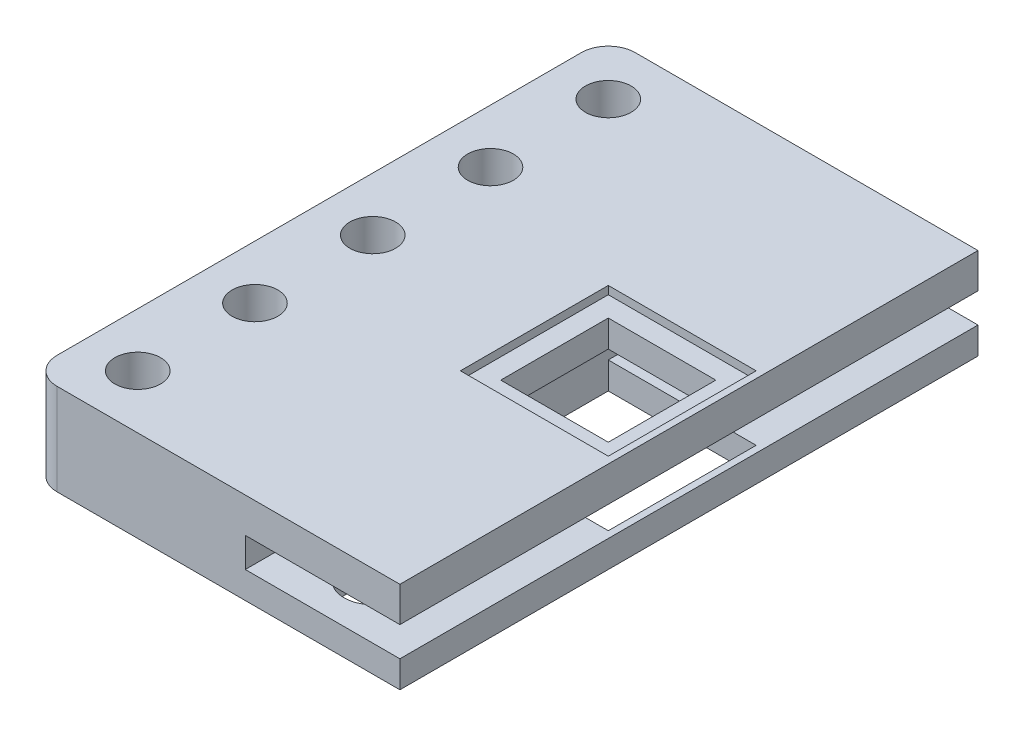
ISO-10303-21;
HEADER;
FILE_DESCRIPTION(('STEP AP214'),'2;1');
FILE_NAME('part.step','',(''),(''),'','','');
FILE_SCHEMA(('AUTOMOTIVE_DESIGN { 1 0 10303 214 1 1 1 1 }'));
ENDSEC;
DATA;
#1=APPLICATION_CONTEXT('core data for automotive mechanical design processes');
#2=APPLICATION_PROTOCOL_DEFINITION('international standard','automotive_design',2000,#1);
#3=PRODUCT_CONTEXT('',#1,'mechanical');
#4=PRODUCT('Part','Part','',(#3));
#5=PRODUCT_RELATED_PRODUCT_CATEGORY('part','',(#4));
#6=PRODUCT_DEFINITION_FORMATION('','',#4);
#7=PRODUCT_DEFINITION_CONTEXT('part definition',#1,'design');
#8=PRODUCT_DEFINITION('design','',#6,#7);
#9=PRODUCT_DEFINITION_SHAPE('','',#8);
#10=(LENGTH_UNIT() NAMED_UNIT(*) SI_UNIT(.MILLI.,.METRE.));
#11=(NAMED_UNIT(*) PLANE_ANGLE_UNIT() SI_UNIT($,.RADIAN.));
#12=(NAMED_UNIT(*) SI_UNIT($,.STERADIAN.) SOLID_ANGLE_UNIT());
#13=UNCERTAINTY_MEASURE_WITH_UNIT(LENGTH_MEASURE(1.E-05),#10,'distance_accuracy_value','');
#14=(GEOMETRIC_REPRESENTATION_CONTEXT(3) GLOBAL_UNCERTAINTY_ASSIGNED_CONTEXT((#13)) GLOBAL_UNIT_ASSIGNED_CONTEXT((#10,
#11,#12)) REPRESENTATION_CONTEXT('',''));
#15=CARTESIAN_POINT('',(0.,0.,0.));
#16=DIRECTION('',(0.,0.,1.));
#17=DIRECTION('',(1.,0.,0.));
#18=AXIS2_PLACEMENT_3D('',#15,#16,#17);
#19=CARTESIAN_POINT('',(-0.933954619124796,0.,-15.7376016731128));
#20=DIRECTION('',(-1.,0.,0.));
#21=DIRECTION('',(0.,0.,1.));
#22=AXIS2_PLACEMENT_3D('',#19,#20,#21);
#23=PLANE('',#22);
#24=DIRECTION('',(0.,-1.,0.));
#25=VECTOR('',#24,1.);
#26=CARTESIAN_POINT('',(-0.933954619124796,3.1,-10.0891410048622));
#27=LINE('',#26,#25);
#28=CARTESIAN_POINT('',(-0.933954619124794,1.,-10.0891410048622));
#29=VERTEX_POINT('',#28);
#30=CARTESIAN_POINT('',(-0.933954619124795,0.,-10.0891410048622));
#31=VERTEX_POINT('',#30);
#32=EDGE_CURVE('E211',#29,#31,#27,.T.);
#33=ORIENTED_EDGE('',*,*,#32,.F.);
#34=DIRECTION('',(0.,0.,-1.));
#35=VECTOR('',#34,1.);
#36=CARTESIAN_POINT('',(-0.933954619124794,1.,11.4108589951378));
#37=LINE('',#36,#35);
#38=CARTESIAN_POINT('',(-0.933954619124792,1.,11.4108589951378));
#39=VERTEX_POINT('',#38);
#40=EDGE_CURVE('E201',#39,#29,#37,.T.);
#41=ORIENTED_EDGE('',*,*,#40,.F.);
#42=DIRECTION('',(0.,1.,0.));
#43=VECTOR('',#42,1.);
#44=CARTESIAN_POINT('',(-0.933954619124792,3.1,11.4108589951378));
#45=LINE('',#44,#43);
#46=CARTESIAN_POINT('',(-0.933954619124792,0.,11.4108589951378));
#47=VERTEX_POINT('',#46);
#48=EDGE_CURVE('E207',#47,#39,#45,.T.);
#49=ORIENTED_EDGE('',*,*,#48,.F.);
#50=DIRECTION('',(0.,0.,1.));
#51=VECTOR('',#50,1.);
#52=CARTESIAN_POINT('',(-0.933954619124796,0.,-15.7376016731128));
#53=LINE('',#52,#51);
#54=EDGE_CURVE('E423',#31,#47,#53,.T.);
#55=ORIENTED_EDGE('',*,*,#54,.F.);
#56=EDGE_LOOP('',(#33,#41,#49,#55));
#57=FACE_BOUND('',#56,.T.);
#58=ADVANCED_FACE('F35',(#57),#23,.F.);
#59=CARTESIAN_POINT('',(0.,0.,0.));
#60=DIRECTION('',(0.,1.,0.));
#61=DIRECTION('',(0.,0.,1.));
#62=AXIS2_PLACEMENT_3D('',#59,#60,#61);
#63=PLANE('',#62);
#64=DIRECTION('',(0.,0.,1.));
#65=VECTOR('',#64,1.);
#66=CARTESIAN_POINT('',(-1.1839546191248,0.,3.41085899513776));
#67=LINE('',#66,#65);
#68=CARTESIAN_POINT('',(-1.1839546191248,0.,-2.08914100486223));
#69=VERTEX_POINT('',#68);
#70=CARTESIAN_POINT('',(-1.1839546191248,0.,3.41085899513776));
#71=VERTEX_POINT('',#70);
#72=EDGE_CURVE('E223',#69,#71,#67,.T.);
#73=ORIENTED_EDGE('',*,*,#72,.F.);
#74=DIRECTION('',(1.,0.,0.));
#75=VECTOR('',#74,1.);
#76=CARTESIAN_POINT('',(-1.1839546191248,0.,-2.08914100486223));
#77=LINE('',#76,#75);
#78=CARTESIAN_POINT('',(-6.6839546191248,0.,-2.08914100486224));
#79=VERTEX_POINT('',#78);
#80=EDGE_CURVE('E220',#79,#69,#77,.T.);
#81=ORIENTED_EDGE('',*,*,#80,.F.);
#82=DIRECTION('',(0.,0.,-1.));
#83=VECTOR('',#82,1.);
#84=CARTESIAN_POINT('',(-6.6839546191248,0.,3.41085899513776));
#85=LINE('',#84,#83);
#86=CARTESIAN_POINT('',(-6.6839546191248,0.,3.41085899513776));
#87=VERTEX_POINT('',#86);
#88=EDGE_CURVE('E217',#87,#79,#85,.T.);
#89=ORIENTED_EDGE('',*,*,#88,.F.);
#90=DIRECTION('',(-1.,0.,0.));
#91=VECTOR('',#90,1.);
#92=CARTESIAN_POINT('',(-1.1839546191248,0.,3.41085899513776));
#93=LINE('',#92,#91);
#94=EDGE_CURVE('E226',#71,#87,#93,.T.);
#95=ORIENTED_EDGE('',*,*,#94,.F.);
#96=EDGE_LOOP('',(#73,#81,#89,#95));
#97=FACE_BOUND('',#96,.T.);
#98=CARTESIAN_POINT('',(-3.9339546191248,0.,5.86085899513776));
#99=DIRECTION('',(0.,-1.,0.));
#100=DIRECTION('',(0.,0.,-1.));
#101=AXIS2_PLACEMENT_3D('',#98,#99,#100);
#102=CIRCLE('',#101,1.075);
#103=CARTESIAN_POINT('',(-3.9339546191248,0.,4.78585899513776));
#104=VERTEX_POINT('',#103);
#105=EDGE_CURVE('E257',#104,#104,#102,.T.);
#106=ORIENTED_EDGE('',*,*,#105,.F.);
#107=EDGE_LOOP('',(#106));
#108=FACE_BOUND('',#107,.T.);
#109=CARTESIAN_POINT('',(-12.6839546191248,0.,-8.08914100486223));
#110=DIRECTION('',(0.,1.,0.));
#111=DIRECTION('',(0.,0.,1.));
#112=AXIS2_PLACEMENT_3D('',#109,#110,#111);
#113=CIRCLE('',#112,0.849999999999998);
#114=CARTESIAN_POINT('',(-12.6839546191248,0.,-7.23914100486224));
#115=VERTEX_POINT('',#114);
#116=EDGE_CURVE('E266',#115,#115,#113,.T.);
#117=ORIENTED_EDGE('',*,*,#116,.T.);
#118=EDGE_LOOP('',(#117));
#119=FACE_BOUND('',#118,.T.);
#120=CARTESIAN_POINT('',(-12.6839546191248,0.,9.41085899513776));
#121=DIRECTION('',(0.,1.,0.));
#122=DIRECTION('',(0.,0.,1.));
#123=AXIS2_PLACEMENT_3D('',#120,#121,#122);
#124=CIRCLE('',#123,0.849999999999998);
#125=CARTESIAN_POINT('',(-12.6839546191248,0.,10.2608589951378));
#126=VERTEX_POINT('',#125);
#127=EDGE_CURVE('E272',#126,#126,#124,.T.);
#128=ORIENTED_EDGE('',*,*,#127,.T.);
#129=EDGE_LOOP('',(#128));
#130=FACE_BOUND('',#129,.T.);
#131=CARTESIAN_POINT('',(-12.6839546191248,0.,-3.70914100486223));
#132=DIRECTION('',(0.,1.,0.));
#133=DIRECTION('',(0.,0.,1.));
#134=AXIS2_PLACEMENT_3D('',#131,#132,#133);
#135=CIRCLE('',#134,0.849999999999998);
#136=CARTESIAN_POINT('',(-12.6839546191248,0.,-2.85914100486224));
#137=VERTEX_POINT('',#136);
#138=EDGE_CURVE('E278',#137,#137,#135,.T.);
#139=ORIENTED_EDGE('',*,*,#138,.T.);
#140=EDGE_LOOP('',(#139));
#141=FACE_BOUND('',#140,.T.);
#142=CARTESIAN_POINT('',(-12.6839546191248,0.,0.670858995137765));
#143=DIRECTION('',(0.,1.,0.));
#144=DIRECTION('',(0.,0.,1.));
#145=AXIS2_PLACEMENT_3D('',#142,#143,#144);
#146=CIRCLE('',#145,0.849999999999998);
#147=CARTESIAN_POINT('',(-12.6839546191248,0.,1.52085899513776));
#148=VERTEX_POINT('',#147);
#149=EDGE_CURVE('E284',#148,#148,#146,.T.);
#150=ORIENTED_EDGE('',*,*,#149,.T.);
#151=EDGE_LOOP('',(#150));
#152=FACE_BOUND('',#151,.T.);
#153=CARTESIAN_POINT('',(-12.6839546191248,0.,5.05085899513777));
#154=DIRECTION('',(0.,1.,0.));
#155=DIRECTION('',(0.,0.,1.));
#156=AXIS2_PLACEMENT_3D('',#153,#154,#155);
#157=CIRCLE('',#156,0.849999999999998);
#158=CARTESIAN_POINT('',(-12.6839546191248,0.,5.90085899513776));
#159=VERTEX_POINT('',#158);
#160=EDGE_CURVE('E290',#159,#159,#157,.T.);
#161=ORIENTED_EDGE('',*,*,#160,.T.);
#162=EDGE_LOOP('',(#161));
#163=FACE_BOUND('',#162,.T.);
#164=DIRECTION('',(-1.,0.,0.));
#165=VECTOR('',#164,1.);
#166=CARTESIAN_POINT('',(-14.6839546191248,0.,-10.0891410048622));
#167=LINE('',#166,#165);
#168=CARTESIAN_POINT('',(-13.6839546191248,0.,-10.0891410048622));
#169=VERTEX_POINT('',#168);
#170=EDGE_CURVE('E384',#31,#169,#167,.T.);
#171=ORIENTED_EDGE('',*,*,#170,.F.);
#172=ORIENTED_EDGE('',*,*,#54,.T.);
#173=DIRECTION('',(1.,0.,0.));
#174=VECTOR('',#173,1.);
#175=CARTESIAN_POINT('',(-14.6839546191248,0.,11.4108589951378));
#176=LINE('',#175,#174);
#177=CARTESIAN_POINT('',(-13.6839546191248,0.,11.4108589951378));
#178=VERTEX_POINT('',#177);
#179=EDGE_CURVE('E381',#178,#47,#176,.T.);
#180=ORIENTED_EDGE('',*,*,#179,.F.);
#181=CARTESIAN_POINT('',(-13.6839546191248,0.,10.4108589951378));
#182=DIRECTION('',(0.,1.,0.));
#183=DIRECTION('',(0.,0.,1.));
#184=AXIS2_PLACEMENT_3D('',#181,#182,#183);
#185=CIRCLE('',#184,1.);
#186=CARTESIAN_POINT('',(-14.6839546191248,0.,10.4108589951378));
#187=VERTEX_POINT('',#186);
#188=EDGE_CURVE('E392',#178,#187,#185,.F.);
#189=ORIENTED_EDGE('',*,*,#188,.T.);
#190=DIRECTION('',(0.,0.,1.));
#191=VECTOR('',#190,1.);
#192=CARTESIAN_POINT('',(-14.6839546191248,0.,-10.0891410048622));
#193=LINE('',#192,#191);
#194=CARTESIAN_POINT('',(-14.6839546191248,0.,-9.08914100486224));
#195=VERTEX_POINT('',#194);
#196=EDGE_CURVE('E375',#195,#187,#193,.T.);
#197=ORIENTED_EDGE('',*,*,#196,.F.);
#198=CARTESIAN_POINT('',(-13.6839546191248,0.,-9.08914100486224));
#199=DIRECTION('',(0.,1.,0.));
#200=DIRECTION('',(0.,0.,1.));
#201=AXIS2_PLACEMENT_3D('',#198,#199,#200);
#202=CIRCLE('',#201,1.);
#203=EDGE_CURVE('E389',#195,#169,#202,.F.);
#204=ORIENTED_EDGE('',*,*,#203,.T.);
#205=EDGE_LOOP('',(#171,#172,#180,#189,#197,#204));
#206=FACE_BOUND('',#205,.T.);
#207=CARTESIAN_POINT('',(-3.9339546191248,0.,-4.53914100486224));
#208=DIRECTION('',(0.,-1.,0.));
#209=DIRECTION('',(0.,0.,-1.));
#210=AXIS2_PLACEMENT_3D('',#207,#208,#209);
#211=CIRCLE('',#210,1.075);
#212=CARTESIAN_POINT('',(-3.9339546191248,0.,-5.61414100486224));
#213=VERTEX_POINT('',#212);
#214=EDGE_CURVE('E251',#213,#213,#211,.T.);
#215=ORIENTED_EDGE('',*,*,#214,.F.);
#216=EDGE_LOOP('',(#215));
#217=FACE_BOUND('',#216,.T.);
#218=CARTESIAN_POINT('',(-3.9339546191248,0.,9.41085899513776));
#219=DIRECTION('',(0.,-1.,0.));
#220=DIRECTION('',(0.,0.,-1.));
#221=AXIS2_PLACEMENT_3D('',#218,#219,#220);
#222=CIRCLE('',#221,1.075);
#223=CARTESIAN_POINT('',(-3.9339546191248,0.,8.33585899513776));
#224=VERTEX_POINT('',#223);
#225=EDGE_CURVE('E245',#224,#224,#222,.T.);
#226=ORIENTED_EDGE('',*,*,#225,.F.);
#227=EDGE_LOOP('',(#226));
#228=FACE_BOUND('',#227,.T.);
#229=CARTESIAN_POINT('',(-3.9339546191248,0.,-8.08914100486223));
#230=DIRECTION('',(0.,-1.,0.));
#231=DIRECTION('',(0.,0.,-1.));
#232=AXIS2_PLACEMENT_3D('',#229,#230,#231);
#233=CIRCLE('',#232,1.075);
#234=CARTESIAN_POINT('',(-3.9339546191248,0.,-9.16414100486223));
#235=VERTEX_POINT('',#234);
#236=EDGE_CURVE('E239',#235,#235,#233,.T.);
#237=ORIENTED_EDGE('',*,*,#236,.F.);
#238=EDGE_LOOP('',(#237));
#239=FACE_BOUND('',#238,.T.);
#240=ADVANCED_FACE('F413',(#97,#108,#119,#130,#141,#152,#163,#206,#217,#228,#239),#63,.F.);
#241=CARTESIAN_POINT('',(-14.6839546191248,3.1,-10.0891410048622));
#242=DIRECTION('',(1.,0.,0.));
#243=DIRECTION('',(0.,0.,-1.));
#244=AXIS2_PLACEMENT_3D('',#241,#242,#243);
#245=PLANE('',#244);
#246=ORIENTED_EDGE('',*,*,#196,.T.);
#247=DIRECTION('',(0.,-1.,0.));
#248=VECTOR('',#247,1.);
#249=CARTESIAN_POINT('',(-14.6839546191248,3.1,10.4108589951378));
#250=LINE('',#249,#248);
#251=CARTESIAN_POINT('',(-14.6839546191248,3.4,10.4108589951378));
#252=VERTEX_POINT('',#251);
#253=EDGE_CURVE('E397',#187,#252,#250,.F.);
#254=ORIENTED_EDGE('',*,*,#253,.T.);
#255=DIRECTION('',(0.,0.,1.));
#256=VECTOR('',#255,1.);
#257=CARTESIAN_POINT('',(-14.6839546191248,3.4,0.));
#258=LINE('',#257,#256);
#259=CARTESIAN_POINT('',(-14.6839546191248,3.4,-9.08914100486224));
#260=VERTEX_POINT('',#259);
#261=EDGE_CURVE('E328',#260,#252,#258,.T.);
#262=ORIENTED_EDGE('',*,*,#261,.F.);
#263=DIRECTION('',(0.,-1.,0.));
#264=VECTOR('',#263,1.);
#265=CARTESIAN_POINT('',(-14.6839546191248,3.1,-9.08914100486224));
#266=LINE('',#265,#264);
#267=EDGE_CURVE('E394',#260,#195,#266,.T.);
#268=ORIENTED_EDGE('',*,*,#267,.T.);
#269=EDGE_LOOP('',(#246,#254,#262,#268));
#270=FACE_BOUND('',#269,.T.);
#271=ADVANCED_FACE('F417',(#270),#245,.F.);
#272=CARTESIAN_POINT('',(-14.6839546191248,3.1,11.4108589951378));
#273=DIRECTION('',(0.,0.,-1.));
#274=DIRECTION('',(-1.,0.,0.));
#275=AXIS2_PLACEMENT_3D('',#272,#273,#274);
#276=PLANE('',#275);
#277=ORIENTED_EDGE('',*,*,#48,.T.);
#278=DIRECTION('',(1.,0.,0.));
#279=VECTOR('',#278,1.);
#280=CARTESIAN_POINT('',(-6.6839546191248,0.999999999999999,11.4108589951378));
#281=LINE('',#280,#279);
#282=CARTESIAN_POINT('',(-6.6839546191248,0.999999999999999,11.4108589951378));
#283=VERTEX_POINT('',#282);
#284=EDGE_CURVE('E50',#283,#39,#281,.T.);
#285=ORIENTED_EDGE('',*,*,#284,.F.);
#286=DIRECTION('',(0.,-1.,0.));
#287=VECTOR('',#286,1.);
#288=CARTESIAN_POINT('',(-6.6839546191248,2.1,11.4108589951378));
#289=LINE('',#288,#287);
#290=CARTESIAN_POINT('',(-6.6839546191248,2.1,11.4108589951378));
#291=VERTEX_POINT('',#290);
#292=EDGE_CURVE('E194',#291,#283,#289,.T.);
#293=ORIENTED_EDGE('',*,*,#292,.F.);
#294=DIRECTION('',(-1.,0.,0.));
#295=VECTOR('',#294,1.);
#296=CARTESIAN_POINT('',(-6.6839546191248,2.1,11.4108589951378));
#297=LINE('',#296,#295);
#298=CARTESIAN_POINT('',(-0.933954619124794,2.1,11.4108589951378));
#299=VERTEX_POINT('',#298);
#300=EDGE_CURVE('E186',#299,#291,#297,.T.);
#301=ORIENTED_EDGE('',*,*,#300,.F.);
#302=CARTESIAN_POINT('',(-0.933954619124792,3.4,11.4108589951378));
#303=VERTEX_POINT('',#302);
#304=EDGE_CURVE('E191',#299,#303,#45,.T.);
#305=ORIENTED_EDGE('',*,*,#304,.T.);
#306=DIRECTION('',(1.,0.,0.));
#307=VECTOR('',#306,1.);
#308=CARTESIAN_POINT('',(0.,3.4,11.4108589951378));
#309=LINE('',#308,#307);
#310=CARTESIAN_POINT('',(-13.6839546191248,3.4,11.4108589951378));
#311=VERTEX_POINT('',#310);
#312=EDGE_CURVE('E332',#311,#303,#309,.T.);
#313=ORIENTED_EDGE('',*,*,#312,.F.);
#314=DIRECTION('',(0.,-1.,0.));
#315=VECTOR('',#314,1.);
#316=CARTESIAN_POINT('',(-13.6839546191248,3.1,11.4108589951378));
#317=LINE('',#316,#315);
#318=EDGE_CURVE('E386',#311,#178,#317,.T.);
#319=ORIENTED_EDGE('',*,*,#318,.T.);
#320=ORIENTED_EDGE('',*,*,#179,.T.);
#321=EDGE_LOOP('',(#277,#285,#293,#301,#305,#313,#319,#320));
#322=FACE_BOUND('',#321,.T.);
#323=ADVANCED_FACE('F188',(#322),#276,.F.);
#324=CARTESIAN_POINT('',(-14.6839546191248,3.1,-10.0891410048622));
#325=DIRECTION('',(0.,0.,1.));
#326=DIRECTION('',(1.,0.,0.));
#327=AXIS2_PLACEMENT_3D('',#324,#325,#326);
#328=PLANE('',#327);
#329=DIRECTION('',(1.,0.,0.));
#330=VECTOR('',#329,1.);
#331=CARTESIAN_POINT('',(-6.6839546191248,0.999999999999999,-10.0891410048622));
#332=LINE('',#331,#330);
#333=CARTESIAN_POINT('',(-6.6839546191248,0.999999999999999,-10.0891410048622));
#334=VERTEX_POINT('',#333);
#335=EDGE_CURVE('E367',#334,#29,#332,.T.);
#336=ORIENTED_EDGE('',*,*,#335,.T.);
#337=ORIENTED_EDGE('',*,*,#32,.T.);
#338=ORIENTED_EDGE('',*,*,#170,.T.);
#339=DIRECTION('',(0.,-1.,0.));
#340=VECTOR('',#339,1.);
#341=CARTESIAN_POINT('',(-13.6839546191248,3.1,-10.0891410048622));
#342=LINE('',#341,#340);
#343=CARTESIAN_POINT('',(-13.6839546191248,3.4,-10.0891410048622));
#344=VERTEX_POINT('',#343);
#345=EDGE_CURVE('E11',#169,#344,#342,.F.);
#346=ORIENTED_EDGE('',*,*,#345,.T.);
#347=DIRECTION('',(-1.,0.,0.));
#348=VECTOR('',#347,1.);
#349=CARTESIAN_POINT('',(0.,3.4,-10.0891410048622));
#350=LINE('',#349,#348);
#351=CARTESIAN_POINT('',(-0.933954619124794,3.4,-10.0891410048622));
#352=VERTEX_POINT('',#351);
#353=EDGE_CURVE('E326',#352,#344,#350,.T.);
#354=ORIENTED_EDGE('',*,*,#353,.F.);
#355=CARTESIAN_POINT('',(-0.933954619124796,2.1,-10.0891410048622));
#356=VERTEX_POINT('',#355);
#357=EDGE_CURVE('E208',#352,#356,#27,.T.);
#358=ORIENTED_EDGE('',*,*,#357,.T.);
#359=DIRECTION('',(-1.,0.,0.));
#360=VECTOR('',#359,1.);
#361=CARTESIAN_POINT('',(-6.6839546191248,2.1,-10.0891410048622));
#362=LINE('',#361,#360);
#363=CARTESIAN_POINT('',(-6.6839546191248,2.1,-10.0891410048622));
#364=VERTEX_POINT('',#363);
#365=EDGE_CURVE('E58',#356,#364,#362,.T.);
#366=ORIENTED_EDGE('',*,*,#365,.T.);
#367=DIRECTION('',(0.,-1.,0.));
#368=VECTOR('',#367,1.);
#369=CARTESIAN_POINT('',(-6.6839546191248,2.1,-10.0891410048622));
#370=LINE('',#369,#368);
#371=EDGE_CURVE('E195',#364,#334,#370,.T.);
#372=ORIENTED_EDGE('',*,*,#371,.T.);
#373=EDGE_LOOP('',(#336,#337,#338,#346,#354,#358,#366,#372));
#374=FACE_BOUND('',#373,.T.);
#375=ADVANCED_FACE('F425',(#374),#328,.F.);
#376=CARTESIAN_POINT('',(-6.6839546191248,2.1,-10.0891410048622));
#377=DIRECTION('',(-1.,0.,0.));
#378=DIRECTION('',(0.,0.,1.));
#379=AXIS2_PLACEMENT_3D('',#376,#377,#378);
#380=PLANE('',#379);
#381=ORIENTED_EDGE('',*,*,#292,.T.);
#382=DIRECTION('',(0.,0.,1.));
#383=VECTOR('',#382,1.);
#384=CARTESIAN_POINT('',(-6.6839546191248,0.999999999999999,-10.0891410048622));
#385=LINE('',#384,#383);
#386=CARTESIAN_POINT('',(-6.6839546191248,1.,3.41085899513776));
#387=VERTEX_POINT('',#386);
#388=EDGE_CURVE('E370',#387,#283,#385,.T.);
#389=ORIENTED_EDGE('',*,*,#388,.F.);
#390=DIRECTION('',(0.,-1.,0.));
#391=VECTOR('',#390,1.);
#392=CARTESIAN_POINT('',(-6.6839546191248,3.401,3.41085899513776));
#393=LINE('',#392,#391);
#394=EDGE_CURVE('E229',#387,#87,#393,.T.);
#395=ORIENTED_EDGE('',*,*,#394,.T.);
#396=ORIENTED_EDGE('',*,*,#88,.T.);
#397=DIRECTION('',(0.,-1.,0.));
#398=VECTOR('',#397,1.);
#399=CARTESIAN_POINT('',(-6.6839546191248,3.401,-2.08914100486224));
#400=LINE('',#399,#398);
#401=CARTESIAN_POINT('',(-6.6839546191248,0.999999999999999,-2.08914100486224));
#402=VERTEX_POINT('',#401);
#403=EDGE_CURVE('E228',#402,#79,#400,.T.);
#404=ORIENTED_EDGE('',*,*,#403,.F.);
#405=EDGE_CURVE('E376',#334,#402,#385,.T.);
#406=ORIENTED_EDGE('',*,*,#405,.F.);
#407=ORIENTED_EDGE('',*,*,#371,.F.);
#408=DIRECTION('',(0.,0.,1.));
#409=VECTOR('',#408,1.);
#410=CARTESIAN_POINT('',(-6.6839546191248,2.1,-10.0891410048622));
#411=LINE('',#410,#409);
#412=EDGE_CURVE('E373',#364,#291,#411,.T.);
#413=ORIENTED_EDGE('',*,*,#412,.T.);
#414=EDGE_LOOP('',(#381,#389,#395,#396,#404,#406,#407,#413));
#415=FACE_BOUND('',#414,.T.);
#416=ADVANCED_FACE('F449',(#415),#380,.F.);
#417=CARTESIAN_POINT('',(-6.6839546191248,2.1,-10.0891410048622));
#418=DIRECTION('',(0.,1.,0.));
#419=DIRECTION('',(-1.,0.,0.));
#420=AXIS2_PLACEMENT_3D('',#417,#418,#419);
#421=PLANE('',#420);
#422=DIRECTION('',(1.,0.,0.));
#423=VECTOR('',#422,1.);
#424=CARTESIAN_POINT('',(-6.6839546191248,2.1,2.66085899513776));
#425=LINE('',#424,#423);
#426=CARTESIAN_POINT('',(-5.9339546191248,2.1,2.66085899513776));
#427=VERTEX_POINT('',#426);
#428=CARTESIAN_POINT('',(-1.9339546191248,2.1,2.66085899513776));
#429=VERTEX_POINT('',#428);
#430=EDGE_CURVE('E319',#427,#429,#425,.T.);
#431=ORIENTED_EDGE('',*,*,#430,.T.);
#432=DIRECTION('',(0.,0.,-1.));
#433=VECTOR('',#432,1.);
#434=CARTESIAN_POINT('',(-1.9339546191248,2.1,-10.0891410048622));
#435=LINE('',#434,#433);
#436=CARTESIAN_POINT('',(-1.9339546191248,2.1,-1.33914100486224));
#437=VERTEX_POINT('',#436);
#438=EDGE_CURVE('E322',#429,#437,#435,.T.);
#439=ORIENTED_EDGE('',*,*,#438,.T.);
#440=DIRECTION('',(-1.,0.,0.));
#441=VECTOR('',#440,1.);
#442=CARTESIAN_POINT('',(-6.6839546191248,2.1,-1.33914100486224));
#443=LINE('',#442,#441);
#444=CARTESIAN_POINT('',(-5.9339546191248,2.1,-1.33914100486224));
#445=VERTEX_POINT('',#444);
#446=EDGE_CURVE('E307',#437,#445,#443,.T.);
#447=ORIENTED_EDGE('',*,*,#446,.T.);
#448=DIRECTION('',(0.,0.,1.));
#449=VECTOR('',#448,1.);
#450=CARTESIAN_POINT('',(-5.9339546191248,2.1,-10.0891410048622));
#451=LINE('',#450,#449);
#452=EDGE_CURVE('E316',#445,#427,#451,.T.);
#453=ORIENTED_EDGE('',*,*,#452,.T.);
#454=EDGE_LOOP('',(#431,#439,#447,#453));
#455=FACE_BOUND('',#454,.T.);
#456=ORIENTED_EDGE('',*,*,#300,.T.);
#457=ORIENTED_EDGE('',*,*,#412,.F.);
#458=ORIENTED_EDGE('',*,*,#365,.F.);
#459=DIRECTION('',(0.,0.,-1.));
#460=VECTOR('',#459,1.);
#461=CARTESIAN_POINT('',(-0.933954619124794,2.1,11.4108589951378));
#462=LINE('',#461,#460);
#463=EDGE_CURVE('E197',#299,#356,#462,.T.);
#464=ORIENTED_EDGE('',*,*,#463,.F.);
#465=EDGE_LOOP('',(#456,#457,#458,#464));
#466=FACE_BOUND('',#465,.T.);
#467=ADVANCED_FACE('F198',(#455,#466),#421,.F.);
#468=CARTESIAN_POINT('',(-1.1839546191248,2.1,-10.0891410048622));
#469=DIRECTION('',(1.,0.,0.));
#470=DIRECTION('',(0.,1.,0.));
#471=AXIS2_PLACEMENT_3D('',#468,#469,#470);
#472=PLANE('',#471);
#473=DIRECTION('',(0.,-1.,0.));
#474=VECTOR('',#473,1.);
#475=CARTESIAN_POINT('',(-1.1839546191248,3.401,3.41085899513776));
#476=LINE('',#475,#474);
#477=CARTESIAN_POINT('',(-1.1839546191248,1.,3.41085899513776));
#478=VERTEX_POINT('',#477);
#479=EDGE_CURVE('E233',#478,#71,#476,.T.);
#480=ORIENTED_EDGE('',*,*,#479,.F.);
#481=DIRECTION('',(0.,0.,-1.));
#482=VECTOR('',#481,1.);
#483=CARTESIAN_POINT('',(-1.1839546191248,1.,11.4108589951378));
#484=LINE('',#483,#482);
#485=CARTESIAN_POINT('',(-1.1839546191248,1.,-2.08914100486223));
#486=VERTEX_POINT('',#485);
#487=EDGE_CURVE('E431',#478,#486,#484,.T.);
#488=ORIENTED_EDGE('',*,*,#487,.T.);
#489=DIRECTION('',(0.,-1.,0.));
#490=VECTOR('',#489,1.);
#491=CARTESIAN_POINT('',(-1.1839546191248,3.401,-2.08914100486223));
#492=LINE('',#491,#490);
#493=EDGE_CURVE('E235',#486,#69,#492,.T.);
#494=ORIENTED_EDGE('',*,*,#493,.T.);
#495=ORIENTED_EDGE('',*,*,#72,.T.);
#496=EDGE_LOOP('',(#480,#488,#494,#495));
#497=FACE_BOUND('',#496,.T.);
#498=ADVANCED_FACE('F437',(#497),#472,.F.);
#499=CARTESIAN_POINT('',(-6.6839546191248,0.999999999999999,-10.0891410048622));
#500=DIRECTION('',(0.,-1.,0.));
#501=DIRECTION('',(1.,0.,0.));
#502=AXIS2_PLACEMENT_3D('',#499,#500,#501);
#503=PLANE('',#502);
#504=CARTESIAN_POINT('',(-3.9339546191248,1.,9.41085899513776));
#505=DIRECTION('',(0.,-1.,0.));
#506=DIRECTION('',(1.,0.,0.));
#507=AXIS2_PLACEMENT_3D('',#504,#505,#506);
#508=CIRCLE('',#507,1.075);
#509=CARTESIAN_POINT('',(-2.8589546191248,1.,9.41085899513776));
#510=VERTEX_POINT('',#509);
#511=EDGE_CURVE('E248',#510,#510,#508,.T.);
#512=ORIENTED_EDGE('',*,*,#511,.T.);
#513=EDGE_LOOP('',(#512));
#514=FACE_BOUND('',#513,.T.);
#515=CARTESIAN_POINT('',(-3.9339546191248,1.,5.86085899513776));
#516=DIRECTION('',(0.,-1.,0.));
#517=DIRECTION('',(1.,0.,0.));
#518=AXIS2_PLACEMENT_3D('',#515,#516,#517);
#519=CIRCLE('',#518,1.075);
#520=CARTESIAN_POINT('',(-2.8589546191248,1.,5.86085899513776));
#521=VERTEX_POINT('',#520);
#522=EDGE_CURVE('E260',#521,#521,#519,.T.);
#523=ORIENTED_EDGE('',*,*,#522,.T.);
#524=EDGE_LOOP('',(#523));
#525=FACE_BOUND('',#524,.T.);
#526=ORIENTED_EDGE('',*,*,#284,.T.);
#527=ORIENTED_EDGE('',*,*,#40,.T.);
#528=ORIENTED_EDGE('',*,*,#335,.F.);
#529=ORIENTED_EDGE('',*,*,#405,.T.);
#530=DIRECTION('',(-1.,0.,0.));
#531=VECTOR('',#530,1.);
#532=CARTESIAN_POINT('',(-1.1839546191248,1.,-2.08914100486223));
#533=LINE('',#532,#531);
#534=EDGE_CURVE('E232',#486,#402,#533,.T.);
#535=ORIENTED_EDGE('',*,*,#534,.F.);
#536=ORIENTED_EDGE('',*,*,#487,.F.);
#537=DIRECTION('',(1.,0.,0.));
#538=VECTOR('',#537,1.);
#539=CARTESIAN_POINT('',(-1.1839546191248,1.,3.41085899513776));
#540=LINE('',#539,#538);
#541=EDGE_CURVE('E210',#387,#478,#540,.T.);
#542=ORIENTED_EDGE('',*,*,#541,.F.);
#543=ORIENTED_EDGE('',*,*,#388,.T.);
#544=EDGE_LOOP('',(#526,#527,#528,#529,#535,#536,#542,#543));
#545=FACE_BOUND('',#544,.T.);
#546=CARTESIAN_POINT('',(-3.9339546191248,1.,-4.53914100486224));
#547=DIRECTION('',(0.,-1.,0.));
#548=DIRECTION('',(1.,0.,0.));
#549=AXIS2_PLACEMENT_3D('',#546,#547,#548);
#550=CIRCLE('',#549,1.075);
#551=CARTESIAN_POINT('',(-2.8589546191248,1.,-4.53914100486224));
#552=VERTEX_POINT('',#551);
#553=EDGE_CURVE('E254',#552,#552,#550,.T.);
#554=ORIENTED_EDGE('',*,*,#553,.T.);
#555=EDGE_LOOP('',(#554));
#556=FACE_BOUND('',#555,.T.);
#557=CARTESIAN_POINT('',(-3.9339546191248,1.,-8.08914100486223));
#558=DIRECTION('',(0.,-1.,0.));
#559=DIRECTION('',(1.,0.,0.));
#560=AXIS2_PLACEMENT_3D('',#557,#558,#559);
#561=CIRCLE('',#560,1.075);
#562=CARTESIAN_POINT('',(-2.8589546191248,1.,-8.08914100486223));
#563=VERTEX_POINT('',#562);
#564=EDGE_CURVE('E242',#563,#563,#561,.T.);
#565=ORIENTED_EDGE('',*,*,#564,.T.);
#566=EDGE_LOOP('',(#565));
#567=FACE_BOUND('',#566,.T.);
#568=ADVANCED_FACE('F445',(#514,#525,#545,#556,#567),#503,.F.);
#569=CARTESIAN_POINT('',(0.,3.4,-2.08914100486223));
#570=DIRECTION('',(0.,0.,-1.));
#571=DIRECTION('',(-1.,0.,0.));
#572=AXIS2_PLACEMENT_3D('',#569,#570,#571);
#573=PLANE('',#572);
#574=DIRECTION('',(1.,0.,0.));
#575=VECTOR('',#574,1.);
#576=CARTESIAN_POINT('',(0.,3.1,-2.08914100486223));
#577=LINE('',#576,#575);
#578=CARTESIAN_POINT('',(-6.6839546191248,3.1,-2.08914100486223));
#579=VERTEX_POINT('',#578);
#580=CARTESIAN_POINT('',(-1.1839546191248,3.1,-2.08914100486223));
#581=VERTEX_POINT('',#580);
#582=EDGE_CURVE('E325',#579,#581,#577,.T.);
#583=ORIENTED_EDGE('',*,*,#582,.T.);
#584=DIRECTION('',(0.,-1.,0.));
#585=VECTOR('',#584,1.);
#586=CARTESIAN_POINT('',(-1.1839546191248,3.4,-2.08914100486223));
#587=LINE('',#586,#585);
#588=CARTESIAN_POINT('',(-1.1839546191248,3.4,-2.08914100486223));
#589=VERTEX_POINT('',#588);
#590=EDGE_CURVE('E362',#589,#581,#587,.T.);
#591=ORIENTED_EDGE('',*,*,#590,.F.);
#592=DIRECTION('',(1.,0.,0.));
#593=VECTOR('',#592,1.);
#594=CARTESIAN_POINT('',(0.,3.4,-2.08914100486223));
#595=LINE('',#594,#593);
#596=CARTESIAN_POINT('',(-6.6839546191248,3.4,-2.08914100486223));
#597=VERTEX_POINT('',#596);
#598=EDGE_CURVE('E334',#597,#589,#595,.T.);
#599=ORIENTED_EDGE('',*,*,#598,.F.);
#600=DIRECTION('',(0.,-1.,0.));
#601=VECTOR('',#600,1.);
#602=CARTESIAN_POINT('',(-6.6839546191248,3.4,-2.08914100486223));
#603=LINE('',#602,#601);
#604=EDGE_CURVE('E345',#597,#579,#603,.T.);
#605=ORIENTED_EDGE('',*,*,#604,.T.);
#606=EDGE_LOOP('',(#583,#591,#599,#605));
#607=FACE_BOUND('',#606,.T.);
#608=ADVANCED_FACE('F680',(#607),#573,.F.);
#609=CARTESIAN_POINT('',(-1.1839546191248,3.4,0.));
#610=DIRECTION('',(1.,0.,0.));
#611=DIRECTION('',(0.,0.,-1.));
#612=AXIS2_PLACEMENT_3D('',#609,#610,#611);
#613=PLANE('',#612);
#614=DIRECTION('',(0.,0.,1.));
#615=VECTOR('',#614,1.);
#616=CARTESIAN_POINT('',(-1.1839546191248,3.1,0.));
#617=LINE('',#616,#615);
#618=CARTESIAN_POINT('',(-1.1839546191248,3.1,3.41085899513776));
#619=VERTEX_POINT('',#618);
#620=EDGE_CURVE('E348',#581,#619,#617,.T.);
#621=ORIENTED_EDGE('',*,*,#620,.T.);
#622=DIRECTION('',(0.,-1.,0.));
#623=VECTOR('',#622,1.);
#624=CARTESIAN_POINT('',(-1.1839546191248,3.4,3.41085899513776));
#625=LINE('',#624,#623);
#626=CARTESIAN_POINT('',(-1.1839546191248,3.4,3.41085899513776));
#627=VERTEX_POINT('',#626);
#628=EDGE_CURVE('E359',#627,#619,#625,.T.);
#629=ORIENTED_EDGE('',*,*,#628,.F.);
#630=DIRECTION('',(0.,0.,1.));
#631=VECTOR('',#630,1.);
#632=CARTESIAN_POINT('',(-1.1839546191248,3.4,0.));
#633=LINE('',#632,#631);
#634=EDGE_CURVE('E337',#589,#627,#633,.T.);
#635=ORIENTED_EDGE('',*,*,#634,.F.);
#636=ORIENTED_EDGE('',*,*,#590,.T.);
#637=EDGE_LOOP('',(#621,#629,#635,#636));
#638=FACE_BOUND('',#637,.T.);
#639=ADVANCED_FACE('F670',(#638),#613,.F.);
#640=CARTESIAN_POINT('',(0.,3.4,3.41085899513776));
#641=DIRECTION('',(0.,0.,-1.));
#642=DIRECTION('',(-1.,0.,0.));
#643=AXIS2_PLACEMENT_3D('',#640,#641,#642);
#644=PLANE('',#643);
#645=DIRECTION('',(1.,0.,0.));
#646=VECTOR('',#645,1.);
#647=CARTESIAN_POINT('',(0.,3.1,3.41085899513776));
#648=LINE('',#647,#646);
#649=CARTESIAN_POINT('',(-6.6839546191248,3.1,3.41085899513776));
#650=VERTEX_POINT('',#649);
#651=EDGE_CURVE('E351',#650,#619,#648,.T.);
#652=ORIENTED_EDGE('',*,*,#651,.F.);
#653=DIRECTION('',(0.,-1.,0.));
#654=VECTOR('',#653,1.);
#655=CARTESIAN_POINT('',(-6.6839546191248,3.4,3.41085899513776));
#656=LINE('',#655,#654);
#657=CARTESIAN_POINT('',(-6.6839546191248,3.4,3.41085899513776));
#658=VERTEX_POINT('',#657);
#659=EDGE_CURVE('E356',#658,#650,#656,.T.);
#660=ORIENTED_EDGE('',*,*,#659,.F.);
#661=DIRECTION('',(1.,0.,0.));
#662=VECTOR('',#661,1.);
#663=CARTESIAN_POINT('',(0.,3.4,3.41085899513776));
#664=LINE('',#663,#662);
#665=EDGE_CURVE('E339',#658,#627,#664,.T.);
#666=ORIENTED_EDGE('',*,*,#665,.T.);
#667=ORIENTED_EDGE('',*,*,#628,.T.);
#668=EDGE_LOOP('',(#652,#660,#666,#667));
#669=FACE_BOUND('',#668,.T.);
#670=ADVANCED_FACE('F659',(#669),#644,.T.);
#671=CARTESIAN_POINT('',(-6.6839546191248,3.4,0.));
#672=DIRECTION('',(1.,0.,0.));
#673=DIRECTION('',(0.,0.,-1.));
#674=AXIS2_PLACEMENT_3D('',#671,#672,#673);
#675=PLANE('',#674);
#676=DIRECTION('',(0.,0.,1.));
#677=VECTOR('',#676,1.);
#678=CARTESIAN_POINT('',(-6.6839546191248,3.1,0.));
#679=LINE('',#678,#677);
#680=EDGE_CURVE('E329',#579,#650,#679,.T.);
#681=ORIENTED_EDGE('',*,*,#680,.F.);
#682=ORIENTED_EDGE('',*,*,#604,.F.);
#683=DIRECTION('',(0.,0.,1.));
#684=VECTOR('',#683,1.);
#685=CARTESIAN_POINT('',(-6.6839546191248,3.4,0.));
#686=LINE('',#685,#684);
#687=EDGE_CURVE('E342',#597,#658,#686,.T.);
#688=ORIENTED_EDGE('',*,*,#687,.T.);
#689=ORIENTED_EDGE('',*,*,#659,.T.);
#690=EDGE_LOOP('',(#681,#682,#688,#689));
#691=FACE_BOUND('',#690,.T.);
#692=ADVANCED_FACE('F654',(#691),#675,.T.);
#693=CARTESIAN_POINT('',(0.,3.4,0.));
#694=DIRECTION('',(0.,1.,0.));
#695=DIRECTION('',(0.,0.,1.));
#696=AXIS2_PLACEMENT_3D('',#693,#694,#695);
#697=PLANE('',#696);
#698=DIRECTION('',(0.,0.,1.));
#699=VECTOR('',#698,1.);
#700=CARTESIAN_POINT('',(-0.933954619124796,3.4,-15.7376016731128));
#701=LINE('',#700,#699);
#702=EDGE_CURVE('E205',#352,#303,#701,.T.);
#703=ORIENTED_EDGE('',*,*,#702,.F.);
#704=ORIENTED_EDGE('',*,*,#353,.T.);
#705=CARTESIAN_POINT('',(-13.6839546191248,3.4,-9.08914100486224));
#706=DIRECTION('',(0.,1.,0.));
#707=DIRECTION('',(0.,0.,1.));
#708=AXIS2_PLACEMENT_3D('',#705,#706,#707);
#709=CIRCLE('',#708,1.);
#710=EDGE_CURVE('E399',#344,#260,#709,.T.);
#711=ORIENTED_EDGE('',*,*,#710,.T.);
#712=ORIENTED_EDGE('',*,*,#261,.T.);
#713=CARTESIAN_POINT('',(-13.6839546191248,3.4,10.4108589951378));
#714=DIRECTION('',(0.,1.,0.));
#715=DIRECTION('',(0.,0.,1.));
#716=AXIS2_PLACEMENT_3D('',#713,#714,#715);
#717=CIRCLE('',#716,1.);
#718=EDGE_CURVE('E43',#252,#311,#717,.T.);
#719=ORIENTED_EDGE('',*,*,#718,.T.);
#720=ORIENTED_EDGE('',*,*,#312,.T.);
#721=EDGE_LOOP('',(#703,#704,#711,#712,#719,#720));
#722=FACE_BOUND('',#721,.T.);
#723=CARTESIAN_POINT('',(-12.6839546191248,3.4,-8.08914100486223));
#724=DIRECTION('',(0.,1.,0.));
#725=DIRECTION('',(0.,0.,1.));
#726=AXIS2_PLACEMENT_3D('',#723,#724,#725);
#727=CIRCLE('',#726,0.85);
#728=CARTESIAN_POINT('',(-12.6839546191248,3.4,-7.23914100486224));
#729=VERTEX_POINT('',#728);
#730=EDGE_CURVE('E263',#729,#729,#727,.T.);
#731=ORIENTED_EDGE('',*,*,#730,.F.);
#732=EDGE_LOOP('',(#731));
#733=FACE_BOUND('',#732,.T.);
#734=CARTESIAN_POINT('',(-12.6839546191248,3.4,9.41085899513776));
#735=DIRECTION('',(0.,1.,0.));
#736=DIRECTION('',(0.,0.,1.));
#737=AXIS2_PLACEMENT_3D('',#734,#735,#736);
#738=CIRCLE('',#737,0.85);
#739=CARTESIAN_POINT('',(-12.6839546191248,3.4,10.2608589951378));
#740=VERTEX_POINT('',#739);
#741=EDGE_CURVE('E269',#740,#740,#738,.T.);
#742=ORIENTED_EDGE('',*,*,#741,.F.);
#743=EDGE_LOOP('',(#742));
#744=FACE_BOUND('',#743,.T.);
#745=CARTESIAN_POINT('',(-12.6839546191248,3.4,-3.70914100486223));
#746=DIRECTION('',(0.,1.,0.));
#747=DIRECTION('',(0.,0.,1.));
#748=AXIS2_PLACEMENT_3D('',#745,#746,#747);
#749=CIRCLE('',#748,0.85);
#750=CARTESIAN_POINT('',(-12.6839546191248,3.4,-2.85914100486223));
#751=VERTEX_POINT('',#750);
#752=EDGE_CURVE('E275',#751,#751,#749,.T.);
#753=ORIENTED_EDGE('',*,*,#752,.F.);
#754=EDGE_LOOP('',(#753));
#755=FACE_BOUND('',#754,.T.);
#756=CARTESIAN_POINT('',(-12.6839546191248,3.4,0.670858995137765));
#757=DIRECTION('',(0.,1.,0.));
#758=DIRECTION('',(0.,0.,1.));
#759=AXIS2_PLACEMENT_3D('',#756,#757,#758);
#760=CIRCLE('',#759,0.85);
#761=CARTESIAN_POINT('',(-12.6839546191248,3.4,1.52085899513777));
#762=VERTEX_POINT('',#761);
#763=EDGE_CURVE('E281',#762,#762,#760,.T.);
#764=ORIENTED_EDGE('',*,*,#763,.F.);
#765=EDGE_LOOP('',(#764));
#766=FACE_BOUND('',#765,.T.);
#767=CARTESIAN_POINT('',(-12.6839546191248,3.4,5.05085899513777));
#768=DIRECTION('',(0.,1.,0.));
#769=DIRECTION('',(0.,0.,1.));
#770=AXIS2_PLACEMENT_3D('',#767,#768,#769);
#771=CIRCLE('',#770,0.85);
#772=CARTESIAN_POINT('',(-12.6839546191248,3.4,5.90085899513777));
#773=VERTEX_POINT('',#772);
#774=EDGE_CURVE('E287',#773,#773,#771,.T.);
#775=ORIENTED_EDGE('',*,*,#774,.F.);
#776=EDGE_LOOP('',(#775));
#777=FACE_BOUND('',#776,.T.);
#778=ORIENTED_EDGE('',*,*,#598,.T.);
#779=ORIENTED_EDGE('',*,*,#634,.T.);
#780=ORIENTED_EDGE('',*,*,#665,.F.);
#781=ORIENTED_EDGE('',*,*,#687,.F.);
#782=EDGE_LOOP('',(#778,#779,#780,#781));
#783=FACE_BOUND('',#782,.T.);
#784=ADVANCED_FACE('F402',(#722,#733,#744,#755,#766,#777,#783),#697,.T.);
#785=CARTESIAN_POINT('',(0.,3.1,0.));
#786=DIRECTION('',(0.,1.,0.));
#787=DIRECTION('',(0.,0.,1.));
#788=AXIS2_PLACEMENT_3D('',#785,#786,#787);
#789=PLANE('',#788);
#790=DIRECTION('',(0.,0.,-1.));
#791=VECTOR('',#790,1.);
#792=CARTESIAN_POINT('',(-1.9339546191248,3.1,2.66085899513776));
#793=LINE('',#792,#791);
#794=CARTESIAN_POINT('',(-1.9339546191248,3.1,2.66085899513776));
#795=VERTEX_POINT('',#794);
#796=CARTESIAN_POINT('',(-1.9339546191248,3.1,-1.33914100486224));
#797=VERTEX_POINT('',#796);
#798=EDGE_CURVE('E293',#795,#797,#793,.T.);
#799=ORIENTED_EDGE('',*,*,#798,.F.);
#800=DIRECTION('',(1.,0.,0.));
#801=VECTOR('',#800,1.);
#802=CARTESIAN_POINT('',(-5.9339546191248,3.1,2.66085899513776));
#803=LINE('',#802,#801);
#804=CARTESIAN_POINT('',(-5.9339546191248,3.1,2.66085899513776));
#805=VERTEX_POINT('',#804);
#806=EDGE_CURVE('E301',#805,#795,#803,.T.);
#807=ORIENTED_EDGE('',*,*,#806,.F.);
#808=DIRECTION('',(0.,0.,1.));
#809=VECTOR('',#808,1.);
#810=CARTESIAN_POINT('',(-5.9339546191248,3.1,2.66085899513776));
#811=LINE('',#810,#809);
#812=CARTESIAN_POINT('',(-5.9339546191248,3.1,-1.33914100486224));
#813=VERTEX_POINT('',#812);
#814=EDGE_CURVE('E299',#813,#805,#811,.T.);
#815=ORIENTED_EDGE('',*,*,#814,.F.);
#816=DIRECTION('',(-1.,0.,0.));
#817=VECTOR('',#816,1.);
#818=CARTESIAN_POINT('',(-5.9339546191248,3.1,-1.33914100486224));
#819=LINE('',#818,#817);
#820=EDGE_CURVE('E296',#797,#813,#819,.T.);
#821=ORIENTED_EDGE('',*,*,#820,.F.);
#822=EDGE_LOOP('',(#799,#807,#815,#821));
#823=FACE_BOUND('',#822,.T.);
#824=ORIENTED_EDGE('',*,*,#620,.F.);
#825=ORIENTED_EDGE('',*,*,#582,.F.);
#826=ORIENTED_EDGE('',*,*,#680,.T.);
#827=ORIENTED_EDGE('',*,*,#651,.T.);
#828=EDGE_LOOP('',(#824,#825,#826,#827));
#829=FACE_BOUND('',#828,.T.);
#830=ADVANCED_FACE('F637',(#823,#829),#789,.T.);
#831=CARTESIAN_POINT('',(-1.9339546191248,0.,2.66085899513776));
#832=DIRECTION('',(1.,0.,0.));
#833=DIRECTION('',(0.,0.,-1.));
#834=AXIS2_PLACEMENT_3D('',#831,#832,#833);
#835=PLANE('',#834);
#836=DIRECTION('',(0.,1.,0.));
#837=VECTOR('',#836,1.);
#838=CARTESIAN_POINT('',(-1.9339546191248,0.,2.66085899513776));
#839=LINE('',#838,#837);
#840=EDGE_CURVE('E305',#429,#795,#839,.T.);
#841=ORIENTED_EDGE('',*,*,#840,.T.);
#842=ORIENTED_EDGE('',*,*,#798,.T.);
#843=DIRECTION('',(0.,1.,0.));
#844=VECTOR('',#843,1.);
#845=CARTESIAN_POINT('',(-1.9339546191248,0.,-1.33914100486224));
#846=LINE('',#845,#844);
#847=EDGE_CURVE('E304',#437,#797,#846,.T.);
#848=ORIENTED_EDGE('',*,*,#847,.F.);
#849=ORIENTED_EDGE('',*,*,#438,.F.);
#850=EDGE_LOOP('',(#841,#842,#848,#849));
#851=FACE_BOUND('',#850,.T.);
#852=ADVANCED_FACE('F627',(#851),#835,.F.);
#853=CARTESIAN_POINT('',(-5.9339546191248,0.,2.66085899513776));
#854=DIRECTION('',(0.,0.,1.));
#855=DIRECTION('',(1.,0.,0.));
#856=AXIS2_PLACEMENT_3D('',#853,#854,#855);
#857=PLANE('',#856);
#858=DIRECTION('',(0.,1.,0.));
#859=VECTOR('',#858,1.);
#860=CARTESIAN_POINT('',(-5.9339546191248,0.,2.66085899513776));
#861=LINE('',#860,#859);
#862=EDGE_CURVE('E308',#427,#805,#861,.T.);
#863=ORIENTED_EDGE('',*,*,#862,.T.);
#864=ORIENTED_EDGE('',*,*,#806,.T.);
#865=ORIENTED_EDGE('',*,*,#840,.F.);
#866=ORIENTED_EDGE('',*,*,#430,.F.);
#867=EDGE_LOOP('',(#863,#864,#865,#866));
#868=FACE_BOUND('',#867,.T.);
#869=ADVANCED_FACE('F617',(#868),#857,.F.);
#870=CARTESIAN_POINT('',(-5.9339546191248,0.,2.66085899513776));
#871=DIRECTION('',(-1.,0.,0.));
#872=DIRECTION('',(0.,0.,1.));
#873=AXIS2_PLACEMENT_3D('',#870,#871,#872);
#874=PLANE('',#873);
#875=DIRECTION('',(0.,1.,0.));
#876=VECTOR('',#875,1.);
#877=CARTESIAN_POINT('',(-5.9339546191248,0.,-1.33914100486224));
#878=LINE('',#877,#876);
#879=EDGE_CURVE('E311',#445,#813,#878,.T.);
#880=ORIENTED_EDGE('',*,*,#879,.T.);
#881=ORIENTED_EDGE('',*,*,#814,.T.);
#882=ORIENTED_EDGE('',*,*,#862,.F.);
#883=ORIENTED_EDGE('',*,*,#452,.F.);
#884=EDGE_LOOP('',(#880,#881,#882,#883));
#885=FACE_BOUND('',#884,.T.);
#886=ADVANCED_FACE('F607',(#885),#874,.F.);
#887=CARTESIAN_POINT('',(-5.9339546191248,0.,-1.33914100486224));
#888=DIRECTION('',(0.,0.,-1.));
#889=DIRECTION('',(-1.,0.,0.));
#890=AXIS2_PLACEMENT_3D('',#887,#888,#889);
#891=PLANE('',#890);
#892=ORIENTED_EDGE('',*,*,#847,.T.);
#893=ORIENTED_EDGE('',*,*,#820,.T.);
#894=ORIENTED_EDGE('',*,*,#879,.F.);
#895=ORIENTED_EDGE('',*,*,#446,.F.);
#896=EDGE_LOOP('',(#892,#893,#894,#895));
#897=FACE_BOUND('',#896,.T.);
#898=ADVANCED_FACE('F597',(#897),#891,.F.);
#899=CARTESIAN_POINT('',(-12.6839546191248,3.4,5.05085899513777));
#900=DIRECTION('',(0.,1.,0.));
#901=DIRECTION('',(0.,0.,1.));
#902=AXIS2_PLACEMENT_3D('',#899,#900,#901);
#903=CYLINDRICAL_SURFACE('',#902,0.849999999999999);
#904=ORIENTED_EDGE('',*,*,#160,.F.);
#905=EDGE_LOOP('',(#904));
#906=FACE_BOUND('',#905,.T.);
#907=ORIENTED_EDGE('',*,*,#774,.T.);
#908=EDGE_LOOP('',(#907));
#909=FACE_BOUND('',#908,.T.);
#910=ADVANCED_FACE('F587',(#906,#909),#903,.F.);
#911=CARTESIAN_POINT('',(-12.6839546191248,3.4,0.670858995137765));
#912=DIRECTION('',(0.,1.,0.));
#913=DIRECTION('',(0.,0.,1.));
#914=AXIS2_PLACEMENT_3D('',#911,#912,#913);
#915=CYLINDRICAL_SURFACE('',#914,0.849999999999999);
#916=ORIENTED_EDGE('',*,*,#149,.F.);
#917=EDGE_LOOP('',(#916));
#918=FACE_BOUND('',#917,.T.);
#919=ORIENTED_EDGE('',*,*,#763,.T.);
#920=EDGE_LOOP('',(#919));
#921=FACE_BOUND('',#920,.T.);
#922=ADVANCED_FACE('F577',(#918,#921),#915,.F.);
#923=CARTESIAN_POINT('',(-12.6839546191248,3.4,-3.70914100486223));
#924=DIRECTION('',(0.,1.,0.));
#925=DIRECTION('',(0.,0.,1.));
#926=AXIS2_PLACEMENT_3D('',#923,#924,#925);
#927=CYLINDRICAL_SURFACE('',#926,0.849999999999999);
#928=ORIENTED_EDGE('',*,*,#138,.F.);
#929=EDGE_LOOP('',(#928));
#930=FACE_BOUND('',#929,.T.);
#931=ORIENTED_EDGE('',*,*,#752,.T.);
#932=EDGE_LOOP('',(#931));
#933=FACE_BOUND('',#932,.T.);
#934=ADVANCED_FACE('F567',(#930,#933),#927,.F.);
#935=CARTESIAN_POINT('',(-12.6839546191248,3.4,9.41085899513776));
#936=DIRECTION('',(0.,1.,0.));
#937=DIRECTION('',(0.,0.,1.));
#938=AXIS2_PLACEMENT_3D('',#935,#936,#937);
#939=CYLINDRICAL_SURFACE('',#938,0.849999999999999);
#940=ORIENTED_EDGE('',*,*,#127,.F.);
#941=EDGE_LOOP('',(#940));
#942=FACE_BOUND('',#941,.T.);
#943=ORIENTED_EDGE('',*,*,#741,.T.);
#944=EDGE_LOOP('',(#943));
#945=FACE_BOUND('',#944,.T.);
#946=ADVANCED_FACE('F557',(#942,#945),#939,.F.);
#947=CARTESIAN_POINT('',(-12.6839546191248,3.4,-8.08914100486223));
#948=DIRECTION('',(0.,1.,0.));
#949=DIRECTION('',(0.,0.,1.));
#950=AXIS2_PLACEMENT_3D('',#947,#948,#949);
#951=CYLINDRICAL_SURFACE('',#950,0.849999999999999);
#952=ORIENTED_EDGE('',*,*,#116,.F.);
#953=EDGE_LOOP('',(#952));
#954=FACE_BOUND('',#953,.T.);
#955=ORIENTED_EDGE('',*,*,#730,.T.);
#956=EDGE_LOOP('',(#955));
#957=FACE_BOUND('',#956,.T.);
#958=ADVANCED_FACE('F546',(#954,#957),#951,.F.);
#959=CARTESIAN_POINT('',(-3.9339546191248,0.,5.86085899513776));
#960=DIRECTION('',(0.,-1.,0.));
#961=DIRECTION('',(0.,0.,-1.));
#962=AXIS2_PLACEMENT_3D('',#959,#960,#961);
#963=CYLINDRICAL_SURFACE('',#962,1.075);
#964=ORIENTED_EDGE('',*,*,#522,.F.);
#965=EDGE_LOOP('',(#964));
#966=FACE_BOUND('',#965,.T.);
#967=ORIENTED_EDGE('',*,*,#105,.T.);
#968=EDGE_LOOP('',(#967));
#969=FACE_BOUND('',#968,.T.);
#970=ADVANCED_FACE('F536',(#966,#969),#963,.F.);
#971=CARTESIAN_POINT('',(-3.9339546191248,0.,-4.53914100486224));
#972=DIRECTION('',(0.,-1.,0.));
#973=DIRECTION('',(0.,0.,-1.));
#974=AXIS2_PLACEMENT_3D('',#971,#972,#973);
#975=CYLINDRICAL_SURFACE('',#974,1.075);
#976=ORIENTED_EDGE('',*,*,#553,.F.);
#977=EDGE_LOOP('',(#976));
#978=FACE_BOUND('',#977,.T.);
#979=ORIENTED_EDGE('',*,*,#214,.T.);
#980=EDGE_LOOP('',(#979));
#981=FACE_BOUND('',#980,.T.);
#982=ADVANCED_FACE('F526',(#978,#981),#975,.F.);
#983=CARTESIAN_POINT('',(-3.9339546191248,0.,9.41085899513776));
#984=DIRECTION('',(0.,-1.,0.));
#985=DIRECTION('',(0.,0.,-1.));
#986=AXIS2_PLACEMENT_3D('',#983,#984,#985);
#987=CYLINDRICAL_SURFACE('',#986,1.075);
#988=ORIENTED_EDGE('',*,*,#511,.F.);
#989=EDGE_LOOP('',(#988));
#990=FACE_BOUND('',#989,.T.);
#991=ORIENTED_EDGE('',*,*,#225,.T.);
#992=EDGE_LOOP('',(#991));
#993=FACE_BOUND('',#992,.T.);
#994=ADVANCED_FACE('F516',(#990,#993),#987,.F.);
#995=CARTESIAN_POINT('',(-3.9339546191248,0.,-8.08914100486223));
#996=DIRECTION('',(0.,-1.,0.));
#997=DIRECTION('',(0.,0.,-1.));
#998=AXIS2_PLACEMENT_3D('',#995,#996,#997);
#999=CYLINDRICAL_SURFACE('',#998,1.075);
#1000=ORIENTED_EDGE('',*,*,#564,.F.);
#1001=EDGE_LOOP('',(#1000));
#1002=FACE_BOUND('',#1001,.T.);
#1003=ORIENTED_EDGE('',*,*,#236,.T.);
#1004=EDGE_LOOP('',(#1003));
#1005=FACE_BOUND('',#1004,.T.);
#1006=ADVANCED_FACE('F463',(#1002,#1005),#999,.F.);
#1007=CARTESIAN_POINT('',(-1.1839546191248,3.401,-2.08914100486223));
#1008=DIRECTION('',(0.,0.,-1.));
#1009=DIRECTION('',(-1.,0.,0.));
#1010=AXIS2_PLACEMENT_3D('',#1007,#1008,#1009);
#1011=PLANE('',#1010);
#1012=ORIENTED_EDGE('',*,*,#534,.T.);
#1013=ORIENTED_EDGE('',*,*,#403,.T.);
#1014=ORIENTED_EDGE('',*,*,#80,.T.);
#1015=ORIENTED_EDGE('',*,*,#493,.F.);
#1016=EDGE_LOOP('',(#1012,#1013,#1014,#1015));
#1017=FACE_BOUND('',#1016,.T.);
#1018=ADVANCED_FACE('F441',(#1017),#1011,.F.);
#1019=CARTESIAN_POINT('',(-1.1839546191248,3.401,3.41085899513776));
#1020=DIRECTION('',(0.,0.,1.));
#1021=DIRECTION('',(1.,0.,0.));
#1022=AXIS2_PLACEMENT_3D('',#1019,#1020,#1021);
#1023=PLANE('',#1022);
#1024=ORIENTED_EDGE('',*,*,#541,.T.);
#1025=ORIENTED_EDGE('',*,*,#479,.T.);
#1026=ORIENTED_EDGE('',*,*,#94,.T.);
#1027=ORIENTED_EDGE('',*,*,#394,.F.);
#1028=EDGE_LOOP('',(#1024,#1025,#1026,#1027));
#1029=FACE_BOUND('',#1028,.T.);
#1030=ADVANCED_FACE('F456',(#1029),#1023,.F.);
#1031=CARTESIAN_POINT('',(-13.6839546191248,3.1,10.4108589951378));
#1032=DIRECTION('',(0.,-1.,0.));
#1033=DIRECTION('',(0.,0.,-1.));
#1034=AXIS2_PLACEMENT_3D('',#1031,#1032,#1033);
#1035=CYLINDRICAL_SURFACE('',#1034,1.);
#1036=ORIENTED_EDGE('',*,*,#718,.F.);
#1037=ORIENTED_EDGE('',*,*,#253,.F.);
#1038=ORIENTED_EDGE('',*,*,#188,.F.);
#1039=ORIENTED_EDGE('',*,*,#318,.F.);
#1040=EDGE_LOOP('',(#1036,#1037,#1038,#1039));
#1041=FACE_BOUND('',#1040,.T.);
#1042=ADVANCED_FACE('F409',(#1041),#1035,.T.);
#1043=CARTESIAN_POINT('',(-13.6839546191248,3.1,-9.08914100486224));
#1044=DIRECTION('',(0.,-1.,0.));
#1045=DIRECTION('',(0.,0.,-1.));
#1046=AXIS2_PLACEMENT_3D('',#1043,#1044,#1045);
#1047=CYLINDRICAL_SURFACE('',#1046,1.);
#1048=ORIENTED_EDGE('',*,*,#710,.F.);
#1049=ORIENTED_EDGE('',*,*,#345,.F.);
#1050=ORIENTED_EDGE('',*,*,#203,.F.);
#1051=ORIENTED_EDGE('',*,*,#267,.F.);
#1052=EDGE_LOOP('',(#1048,#1049,#1050,#1051));
#1053=FACE_BOUND('',#1052,.T.);
#1054=ADVANCED_FACE('F37',(#1053),#1047,.T.);
#1055=ORIENTED_EDGE('',*,*,#304,.F.);
#1056=ORIENTED_EDGE('',*,*,#463,.T.);
#1057=ORIENTED_EDGE('',*,*,#357,.F.);
#1058=ORIENTED_EDGE('',*,*,#702,.T.);
#1059=EDGE_LOOP('',(#1055,#1056,#1057,#1058));
#1060=FACE_BOUND('',#1059,.T.);
#1061=ADVANCED_FACE('F203',(#1060),#23,.F.);
#1062=CLOSED_SHELL('',(#58,#240,#271,#323,#375,#416,#467,#498,#568,#608,#639,#670,#692,#784,
#830,#852,#869,#886,#898,#910,#922,#934,#946,#958,#970,#982,#994,#1006,#1018,#1030,#1042,#1054,#1061));
#1063=MANIFOLD_SOLID_BREP('B2',#1062);
#1064=ADVANCED_BREP_SHAPE_REPRESENTATION('',(#18,#1063),#14);
#1065=SHAPE_DEFINITION_REPRESENTATION(#9,#1064);
ENDSEC;
END-ISO-10303-21;
